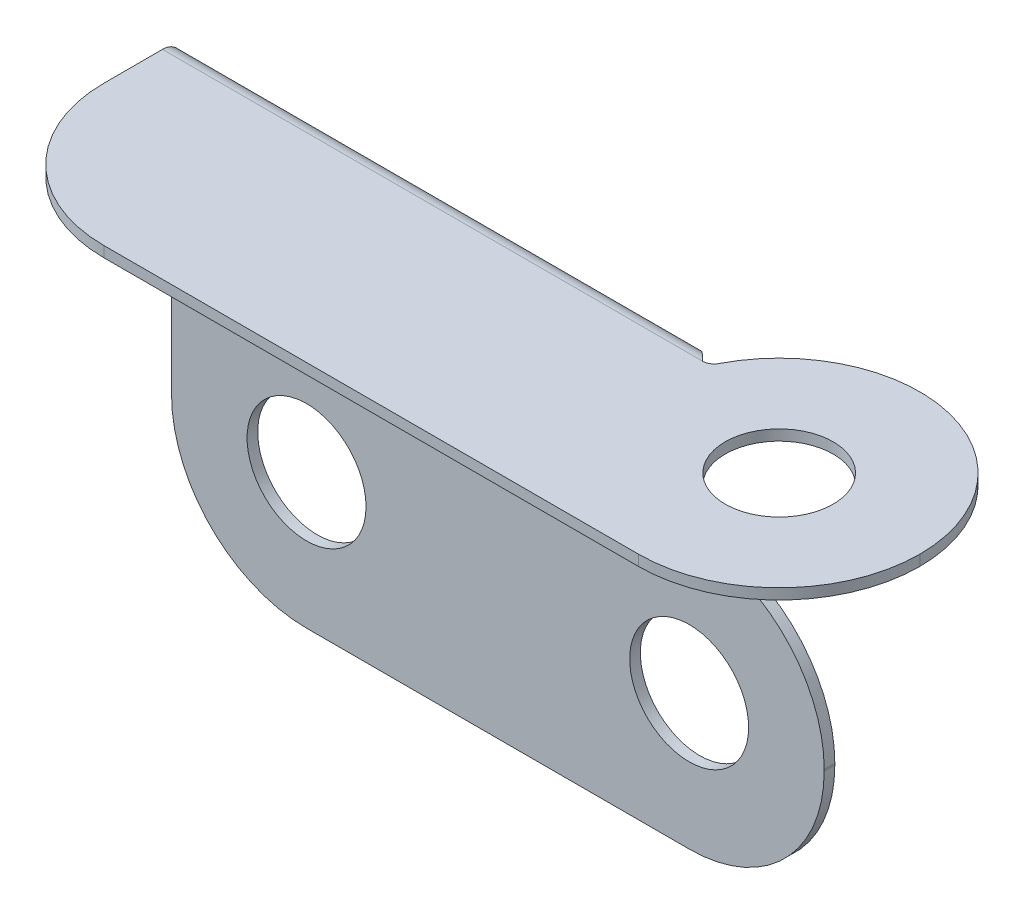
ISO-10303-21;
HEADER;
FILE_DESCRIPTION(('STEP AP214'),'2;1');
FILE_NAME('part.step','',(''),(''),'','','');
FILE_SCHEMA(('AUTOMOTIVE_DESIGN { 1 0 10303 214 1 1 1 1 }'));
ENDSEC;
DATA;
#1=APPLICATION_CONTEXT('core data for automotive mechanical design processes');
#2=APPLICATION_PROTOCOL_DEFINITION('international standard','automotive_design',2000,#1);
#3=PRODUCT_CONTEXT('',#1,'mechanical');
#4=PRODUCT('Part','Part','',(#3));
#5=PRODUCT_RELATED_PRODUCT_CATEGORY('part','',(#4));
#6=PRODUCT_DEFINITION_FORMATION('','',#4);
#7=PRODUCT_DEFINITION_CONTEXT('part definition',#1,'design');
#8=PRODUCT_DEFINITION('design','',#6,#7);
#9=PRODUCT_DEFINITION_SHAPE('','',#8);
#10=(LENGTH_UNIT() NAMED_UNIT(*) SI_UNIT(.MILLI.,.METRE.));
#11=(NAMED_UNIT(*) PLANE_ANGLE_UNIT() SI_UNIT($,.RADIAN.));
#12=(NAMED_UNIT(*) SI_UNIT($,.STERADIAN.) SOLID_ANGLE_UNIT());
#13=UNCERTAINTY_MEASURE_WITH_UNIT(LENGTH_MEASURE(1.E-05),#10,'distance_accuracy_value','');
#14=(GEOMETRIC_REPRESENTATION_CONTEXT(3) GLOBAL_UNCERTAINTY_ASSIGNED_CONTEXT((#13)) GLOBAL_UNIT_ASSIGNED_CONTEXT((#10,
#11,#12)) REPRESENTATION_CONTEXT('',''));
#15=CARTESIAN_POINT('',(0.,0.,0.));
#16=DIRECTION('',(0.,0.,1.));
#17=DIRECTION('',(1.,0.,0.));
#18=AXIS2_PLACEMENT_3D('',#15,#16,#17);
#19=CARTESIAN_POINT('',(19.685,16.51,5.334));
#20=DIRECTION('',(0.,1.,0.));
#21=DIRECTION('',(-1.,0.,0.));
#22=AXIS2_PLACEMENT_3D('',#19,#20,#21);
#23=CYLINDRICAL_SURFACE('',#22,7.9375);
#24=CARTESIAN_POINT('',(19.685,16.51,5.334));
#25=DIRECTION('',(0.,1.,0.));
#26=DIRECTION('',(-1.,0.,0.));
#27=AXIS2_PLACEMENT_3D('',#24,#25,#26);
#28=CIRCLE('',#27,7.9375);
#29=CARTESIAN_POINT('',(12.6362392924122,16.51,1.68449609711593));
#30=VERTEX_POINT('',#29);
#31=CARTESIAN_POINT('',(27.6225,16.51,5.334));
#32=VERTEX_POINT('',#31);
#33=EDGE_CURVE('E479',#30,#32,#28,.F.);
#34=ORIENTED_EDGE('',*,*,#33,.F.);
#35=DIRECTION('',(0.,-1.,0.));
#36=VECTOR('',#35,1.);
#37=CARTESIAN_POINT('',(12.6362392924122,19.05,1.68449609711593));
#38=LINE('',#37,#36);
#39=CARTESIAN_POINT('',(12.6362392924122,17.11,1.68449609711593));
#40=VERTEX_POINT('',#39);
#41=EDGE_CURVE('E138',#40,#30,#38,.T.);
#42=ORIENTED_EDGE('',*,*,#41,.F.);
#43=CARTESIAN_POINT('',(19.685,17.11,5.334));
#44=DIRECTION('',(0.,1.,0.));
#45=DIRECTION('',(-1.,0.,0.));
#46=AXIS2_PLACEMENT_3D('',#43,#44,#45);
#47=CIRCLE('',#46,7.9375);
#48=CARTESIAN_POINT('',(27.6225,17.11,5.334));
#49=VERTEX_POINT('',#48);
#50=EDGE_CURVE('E136',#40,#49,#47,.F.);
#51=ORIENTED_EDGE('',*,*,#50,.T.);
#52=DIRECTION('',(0.,-1.,0.));
#53=VECTOR('',#52,1.);
#54=CARTESIAN_POINT('',(27.6225,16.51,5.334));
#55=LINE('',#54,#53);
#56=EDGE_CURVE('E50',#49,#32,#55,.T.);
#57=ORIENTED_EDGE('',*,*,#56,.T.);
#58=EDGE_LOOP('',(#34,#42,#51,#57));
#59=FACE_BOUND('',#58,.T.);
#60=ADVANCED_FACE('F38',(#59),#23,.T.);
#61=CARTESIAN_POINT('',(19.685,16.51,5.334));
#62=DIRECTION('',(0.,1.,0.));
#63=DIRECTION('',(-1.,0.,0.));
#64=AXIS2_PLACEMENT_3D('',#61,#62,#63);
#65=CYLINDRICAL_SURFACE('',#64,7.9375);
#66=ORIENTED_EDGE('',*,*,#56,.F.);
#67=CARTESIAN_POINT('',(19.685,17.11,5.334));
#68=DIRECTION('',(0.,1.,0.));
#69=DIRECTION('',(-1.,0.,0.));
#70=AXIS2_PLACEMENT_3D('',#67,#68,#69);
#71=CIRCLE('',#70,7.9375);
#72=CARTESIAN_POINT('',(19.685,17.11,13.2715));
#73=VERTEX_POINT('',#72);
#74=EDGE_CURVE('E269',#49,#73,#71,.F.);
#75=ORIENTED_EDGE('',*,*,#74,.T.);
#76=DIRECTION('',(0.,-1.,0.));
#77=VECTOR('',#76,1.);
#78=CARTESIAN_POINT('',(19.685,16.51,13.2715));
#79=LINE('',#78,#77);
#80=CARTESIAN_POINT('',(19.685,16.51,13.2715));
#81=VERTEX_POINT('',#80);
#82=EDGE_CURVE('E275',#73,#81,#79,.T.);
#83=ORIENTED_EDGE('',*,*,#82,.T.);
#84=CARTESIAN_POINT('',(19.685,16.51,5.334));
#85=DIRECTION('',(0.,1.,0.));
#86=DIRECTION('',(-1.,0.,0.));
#87=AXIS2_PLACEMENT_3D('',#84,#85,#86);
#88=CIRCLE('',#87,7.9375);
#89=EDGE_CURVE('E272',#32,#81,#88,.F.);
#90=ORIENTED_EDGE('',*,*,#89,.F.);
#91=EDGE_LOOP('',(#66,#75,#83,#90));
#92=FACE_BOUND('',#91,.T.);
#93=ADVANCED_FACE('F257',(#92),#65,.T.);
#94=CARTESIAN_POINT('',(27.6225,16.51,13.2715));
#95=DIRECTION('',(0.,0.,1.));
#96=DIRECTION('',(1.,0.,0.));
#97=AXIS2_PLACEMENT_3D('',#94,#95,#96);
#98=PLANE('',#97);
#99=ORIENTED_EDGE('',*,*,#82,.F.);
#100=DIRECTION('',(-1.,0.,0.));
#101=VECTOR('',#100,1.);
#102=CARTESIAN_POINT('',(27.6225,17.11,13.2715));
#103=LINE('',#102,#101);
#104=CARTESIAN_POINT('',(-10.4775,17.11,13.2715));
#105=VERTEX_POINT('',#104);
#106=EDGE_CURVE('E279',#105,#73,#103,.F.);
#107=ORIENTED_EDGE('',*,*,#106,.F.);
#108=DIRECTION('',(0.,-1.,0.));
#109=VECTOR('',#108,1.);
#110=CARTESIAN_POINT('',(-10.4775,16.51,13.2715));
#111=LINE('',#110,#109);
#112=CARTESIAN_POINT('',(-10.4775,16.51,13.2715));
#113=VERTEX_POINT('',#112);
#114=EDGE_CURVE('E368',#105,#113,#111,.T.);
#115=ORIENTED_EDGE('',*,*,#114,.T.);
#116=DIRECTION('',(1.,0.,0.));
#117=VECTOR('',#116,1.);
#118=CARTESIAN_POINT('',(27.6225,16.51,13.2715));
#119=LINE('',#118,#117);
#120=EDGE_CURVE('E373',#113,#81,#119,.T.);
#121=ORIENTED_EDGE('',*,*,#120,.T.);
#122=EDGE_LOOP('',(#99,#107,#115,#121));
#123=FACE_BOUND('',#122,.T.);
#124=ADVANCED_FACE('F254',(#123),#98,.T.);
#125=CARTESIAN_POINT('',(-10.4775,16.51,5.334));
#126=DIRECTION('',(0.,1.,0.));
#127=DIRECTION('',(-1.,0.,0.));
#128=AXIS2_PLACEMENT_3D('',#125,#126,#127);
#129=CYLINDRICAL_SURFACE('',#128,7.9375);
#130=ORIENTED_EDGE('',*,*,#114,.F.);
#131=CARTESIAN_POINT('',(-10.4775,17.11,5.334));
#132=DIRECTION('',(0.,1.,0.));
#133=DIRECTION('',(-1.,0.,0.));
#134=AXIS2_PLACEMENT_3D('',#131,#132,#133);
#135=CIRCLE('',#134,7.9375);
#136=CARTESIAN_POINT('',(-18.415,17.11,5.334));
#137=VERTEX_POINT('',#136);
#138=EDGE_CURVE('E331',#105,#137,#135,.F.);
#139=ORIENTED_EDGE('',*,*,#138,.T.);
#140=DIRECTION('',(0.,-1.,0.));
#141=VECTOR('',#140,1.);
#142=CARTESIAN_POINT('',(-18.415,16.51,5.334));
#143=LINE('',#142,#141);
#144=CARTESIAN_POINT('',(-18.415,16.51,5.334));
#145=VERTEX_POINT('',#144);
#146=EDGE_CURVE('E365',#137,#145,#143,.T.);
#147=ORIENTED_EDGE('',*,*,#146,.T.);
#148=CARTESIAN_POINT('',(-10.4775,16.51,5.334));
#149=DIRECTION('',(0.,1.,0.));
#150=DIRECTION('',(-1.,0.,0.));
#151=AXIS2_PLACEMENT_3D('',#148,#149,#150);
#152=CIRCLE('',#151,7.9375);
#153=EDGE_CURVE('E473',#113,#145,#152,.F.);
#154=ORIENTED_EDGE('',*,*,#153,.F.);
#155=EDGE_LOOP('',(#130,#139,#147,#154));
#156=FACE_BOUND('',#155,.T.);
#157=ADVANCED_FACE('F250',(#156),#129,.T.);
#158=CARTESIAN_POINT('',(-18.415,16.51,40.3019963374704));
#159=DIRECTION('',(1.,0.,0.));
#160=DIRECTION('',(0.,0.,-1.));
#161=AXIS2_PLACEMENT_3D('',#158,#159,#160);
#162=PLANE('',#161);
#163=ORIENTED_EDGE('',*,*,#146,.F.);
#164=DIRECTION('',(0.,0.,1.));
#165=VECTOR('',#164,1.);
#166=CARTESIAN_POINT('',(-18.415,17.11,13.2715));
#167=LINE('',#166,#165);
#168=CARTESIAN_POINT('',(-18.415,17.11,2.032));
#169=VERTEX_POINT('',#168);
#170=EDGE_CURVE('E326',#137,#169,#167,.F.);
#171=ORIENTED_EDGE('',*,*,#170,.T.);
#172=DIRECTION('',(0.,-1.,0.));
#173=VECTOR('',#172,1.);
#174=CARTESIAN_POINT('',(-18.415,16.51,2.032));
#175=LINE('',#174,#173);
#176=CARTESIAN_POINT('',(-18.415,16.51,2.032));
#177=VERTEX_POINT('',#176);
#178=EDGE_CURVE('E378',#169,#177,#175,.T.);
#179=ORIENTED_EDGE('',*,*,#178,.T.);
#180=DIRECTION('',(0.,0.,-1.));
#181=VECTOR('',#180,1.);
#182=CARTESIAN_POINT('',(-18.415,16.51,40.3019963374704));
#183=LINE('',#182,#181);
#184=EDGE_CURVE('E469',#145,#177,#183,.T.);
#185=ORIENTED_EDGE('',*,*,#184,.F.);
#186=EDGE_LOOP('',(#163,#171,#179,#185));
#187=FACE_BOUND('',#186,.T.);
#188=ADVANCED_FACE('F246',(#187),#162,.F.);
#189=CARTESIAN_POINT('',(-18.415,16.002,2.032));
#190=DIRECTION('',(-1.,0.,0.));
#191=DIRECTION('',(0.,-1.,0.));
#192=AXIS2_PLACEMENT_3D('',#189,#190,#191);
#193=PLANE('',#192);
#194=ORIENTED_EDGE('',*,*,#178,.F.);
#195=CARTESIAN_POINT('',(-18.415,16.002,2.032));
#196=DIRECTION('',(1.,0.,0.));
#197=DIRECTION('',(0.,1.,0.));
#198=AXIS2_PLACEMENT_3D('',#195,#196,#197);
#199=CIRCLE('',#198,1.108);
#200=CARTESIAN_POINT('',(-18.415,16.002,0.924000000000001));
#201=VERTEX_POINT('',#200);
#202=EDGE_CURVE('E146',#169,#201,#199,.F.);
#203=ORIENTED_EDGE('',*,*,#202,.T.);
#204=DIRECTION('',(0.,0.,1.));
#205=VECTOR('',#204,1.);
#206=CARTESIAN_POINT('',(-18.415,16.002,1.524));
#207=LINE('',#206,#205);
#208=CARTESIAN_POINT('',(-18.415,16.002,1.524));
#209=VERTEX_POINT('',#208);
#210=EDGE_CURVE('E381',#201,#209,#207,.T.);
#211=ORIENTED_EDGE('',*,*,#210,.T.);
#212=CARTESIAN_POINT('',(-18.415,16.002,2.032));
#213=DIRECTION('',(1.,0.,0.));
#214=DIRECTION('',(0.,1.,0.));
#215=AXIS2_PLACEMENT_3D('',#212,#213,#214);
#216=CIRCLE('',#215,0.508);
#217=EDGE_CURVE('E334',#177,#209,#216,.F.);
#218=ORIENTED_EDGE('',*,*,#217,.F.);
#219=EDGE_LOOP('',(#194,#203,#211,#218));
#220=FACE_BOUND('',#219,.T.);
#221=ADVANCED_FACE('F242',(#220),#193,.T.);
#222=CARTESIAN_POINT('',(-18.415,18.034,1.524));
#223=DIRECTION('',(-1.,0.,0.));
#224=DIRECTION('',(0.,-1.,0.));
#225=AXIS2_PLACEMENT_3D('',#222,#223,#224);
#226=PLANE('',#225);
#227=ORIENTED_EDGE('',*,*,#210,.F.);
#228=DIRECTION('',(0.,1.,0.));
#229=VECTOR('',#228,1.);
#230=CARTESIAN_POINT('',(-18.415,0.,0.924));
#231=LINE('',#230,#229);
#232=CARTESIAN_POINT('',(-18.415,0.,0.924));
#233=VERTEX_POINT('',#232);
#234=EDGE_CURVE('E329',#201,#233,#231,.F.);
#235=ORIENTED_EDGE('',*,*,#234,.T.);
#236=DIRECTION('',(0.,0.,1.));
#237=VECTOR('',#236,1.);
#238=CARTESIAN_POINT('',(-18.415,0.,1.524));
#239=LINE('',#238,#237);
#240=CARTESIAN_POINT('',(-18.415,0.,1.524));
#241=VERTEX_POINT('',#240);
#242=EDGE_CURVE('E383',#233,#241,#239,.T.);
#243=ORIENTED_EDGE('',*,*,#242,.T.);
#244=DIRECTION('',(0.,-1.,0.));
#245=VECTOR('',#244,1.);
#246=CARTESIAN_POINT('',(-18.415,18.034,1.524));
#247=LINE('',#246,#245);
#248=EDGE_CURVE('E436',#209,#241,#247,.T.);
#249=ORIENTED_EDGE('',*,*,#248,.F.);
#250=EDGE_LOOP('',(#227,#235,#243,#249));
#251=FACE_BOUND('',#250,.T.);
#252=ADVANCED_FACE('F238',(#251),#226,.T.);
#253=CARTESIAN_POINT('',(-10.795,0.,1.524));
#254=DIRECTION('',(0.,0.,1.));
#255=DIRECTION('',(1.,0.,0.));
#256=AXIS2_PLACEMENT_3D('',#253,#254,#255);
#257=CYLINDRICAL_SURFACE('',#256,7.62);
#258=ORIENTED_EDGE('',*,*,#242,.F.);
#259=CARTESIAN_POINT('',(-10.795,0.,0.924));
#260=DIRECTION('',(0.,0.,1.));
#261=DIRECTION('',(1.,0.,0.));
#262=AXIS2_PLACEMENT_3D('',#259,#260,#261);
#263=CIRCLE('',#262,7.62);
#264=CARTESIAN_POINT('',(-10.795,-7.62,0.924));
#265=VERTEX_POINT('',#264);
#266=EDGE_CURVE('E355',#233,#265,#263,.T.);
#267=ORIENTED_EDGE('',*,*,#266,.T.);
#268=DIRECTION('',(0.,0.,1.));
#269=VECTOR('',#268,1.);
#270=CARTESIAN_POINT('',(-10.795,-7.62,1.524));
#271=LINE('',#270,#269);
#272=CARTESIAN_POINT('',(-10.795,-7.62,1.524));
#273=VERTEX_POINT('',#272);
#274=EDGE_CURVE('E386',#265,#273,#271,.T.);
#275=ORIENTED_EDGE('',*,*,#274,.T.);
#276=CARTESIAN_POINT('',(-10.795,0.,1.524));
#277=DIRECTION('',(0.,0.,1.));
#278=DIRECTION('',(1.,0.,0.));
#279=AXIS2_PLACEMENT_3D('',#276,#277,#278);
#280=CIRCLE('',#279,7.62);
#281=EDGE_CURVE('E440',#241,#273,#280,.T.);
#282=ORIENTED_EDGE('',*,*,#281,.F.);
#283=EDGE_LOOP('',(#258,#267,#275,#282));
#284=FACE_BOUND('',#283,.T.);
#285=ADVANCED_FACE('F234',(#284),#257,.T.);
#286=CARTESIAN_POINT('',(-18.415,-7.62,1.524));
#287=DIRECTION('',(0.,-1.,0.));
#288=DIRECTION('',(1.,0.,0.));
#289=AXIS2_PLACEMENT_3D('',#286,#287,#288);
#290=PLANE('',#289);
#291=ORIENTED_EDGE('',*,*,#274,.F.);
#292=DIRECTION('',(1.,0.,0.));
#293=VECTOR('',#292,1.);
#294=CARTESIAN_POINT('',(0.,-7.62,0.924));
#295=LINE('',#294,#293);
#296=CARTESIAN_POINT('',(10.795,-7.62,0.924));
#297=VERTEX_POINT('',#296);
#298=EDGE_CURVE('E352',#265,#297,#295,.T.);
#299=ORIENTED_EDGE('',*,*,#298,.T.);
#300=DIRECTION('',(0.,0.,1.));
#301=VECTOR('',#300,1.);
#302=CARTESIAN_POINT('',(10.795,-7.62,1.524));
#303=LINE('',#302,#301);
#304=CARTESIAN_POINT('',(10.795,-7.62,1.524));
#305=VERTEX_POINT('',#304);
#306=EDGE_CURVE('E389',#297,#305,#303,.T.);
#307=ORIENTED_EDGE('',*,*,#306,.T.);
#308=DIRECTION('',(1.,0.,0.));
#309=VECTOR('',#308,1.);
#310=CARTESIAN_POINT('',(-18.415,-7.62,1.524));
#311=LINE('',#310,#309);
#312=EDGE_CURVE('E443',#273,#305,#311,.T.);
#313=ORIENTED_EDGE('',*,*,#312,.F.);
#314=EDGE_LOOP('',(#291,#299,#307,#313));
#315=FACE_BOUND('',#314,.T.);
#316=ADVANCED_FACE('F230',(#315),#290,.T.);
#317=CARTESIAN_POINT('',(10.795,0.,1.524));
#318=DIRECTION('',(0.,0.,1.));
#319=DIRECTION('',(1.,0.,0.));
#320=AXIS2_PLACEMENT_3D('',#317,#318,#319);
#321=CYLINDRICAL_SURFACE('',#320,7.62);
#322=ORIENTED_EDGE('',*,*,#306,.F.);
#323=CARTESIAN_POINT('',(10.795,0.,0.924));
#324=DIRECTION('',(0.,0.,1.));
#325=DIRECTION('',(1.,0.,0.));
#326=AXIS2_PLACEMENT_3D('',#323,#324,#325);
#327=CIRCLE('',#326,7.62);
#328=CARTESIAN_POINT('',(18.415,0.,0.924));
#329=VERTEX_POINT('',#328);
#330=EDGE_CURVE('E349',#297,#329,#327,.T.);
#331=ORIENTED_EDGE('',*,*,#330,.T.);
#332=DIRECTION('',(0.,0.,1.));
#333=VECTOR('',#332,1.);
#334=CARTESIAN_POINT('',(18.415,0.,1.524));
#335=LINE('',#334,#333);
#336=CARTESIAN_POINT('',(18.415,0.,1.524));
#337=VERTEX_POINT('',#336);
#338=EDGE_CURVE('E392',#329,#337,#335,.T.);
#339=ORIENTED_EDGE('',*,*,#338,.T.);
#340=CARTESIAN_POINT('',(10.795,0.,1.524));
#341=DIRECTION('',(0.,0.,1.));
#342=DIRECTION('',(1.,0.,0.));
#343=AXIS2_PLACEMENT_3D('',#340,#341,#342);
#344=CIRCLE('',#343,7.62);
#345=EDGE_CURVE('E451',#305,#337,#344,.T.);
#346=ORIENTED_EDGE('',*,*,#345,.F.);
#347=EDGE_LOOP('',(#322,#331,#339,#346));
#348=FACE_BOUND('',#347,.T.);
#349=ADVANCED_FACE('F226',(#348),#321,.T.);
#350=CARTESIAN_POINT('',(18.415,7.62,1.524));
#351=DIRECTION('',(1.,0.,0.));
#352=DIRECTION('',(0.,1.,0.));
#353=AXIS2_PLACEMENT_3D('',#350,#351,#352);
#354=PLANE('',#353);
#355=ORIENTED_EDGE('',*,*,#338,.F.);
#356=DIRECTION('',(0.,1.,0.));
#357=VECTOR('',#356,1.);
#358=CARTESIAN_POINT('',(18.415,0.,0.924));
#359=LINE('',#358,#357);
#360=CARTESIAN_POINT('',(18.415,0.0796875048439151,0.924));
#361=VERTEX_POINT('',#360);
#362=EDGE_CURVE('E346',#329,#361,#359,.T.);
#363=ORIENTED_EDGE('',*,*,#362,.T.);
#364=DIRECTION('',(0.,0.,1.));
#365=VECTOR('',#364,1.);
#366=CARTESIAN_POINT('',(18.415,0.0796875048439151,1.524));
#367=LINE('',#366,#365);
#368=CARTESIAN_POINT('',(18.415,0.0796875048439151,1.524));
#369=VERTEX_POINT('',#368);
#370=EDGE_CURVE('E395',#361,#369,#367,.T.);
#371=ORIENTED_EDGE('',*,*,#370,.T.);
#372=DIRECTION('',(0.,1.,0.));
#373=VECTOR('',#372,1.);
#374=CARTESIAN_POINT('',(18.415,7.62,1.524));
#375=LINE('',#374,#373);
#376=EDGE_CURVE('E454',#337,#369,#375,.T.);
#377=ORIENTED_EDGE('',*,*,#376,.F.);
#378=EDGE_LOOP('',(#355,#363,#371,#377));
#379=FACE_BOUND('',#378,.T.);
#380=ADVANCED_FACE('F222',(#379),#354,.T.);
#381=CARTESIAN_POINT('',(10.795,0.0796875048439116,1.524));
#382=DIRECTION('',(0.,0.,1.));
#383=DIRECTION('',(1.,0.,0.));
#384=AXIS2_PLACEMENT_3D('',#381,#382,#383);
#385=CYLINDRICAL_SURFACE('',#384,7.62);
#386=ORIENTED_EDGE('',*,*,#370,.F.);
#387=CARTESIAN_POINT('',(10.795,0.0796875048439116,0.923999999999999));
#388=DIRECTION('',(0.,0.,1.));
#389=DIRECTION('',(1.,0.,0.));
#390=AXIS2_PLACEMENT_3D('',#387,#388,#389);
#391=CIRCLE('',#390,7.62);
#392=CARTESIAN_POINT('',(11.7475,7.63992187621098,0.924));
#393=VERTEX_POINT('',#392);
#394=EDGE_CURVE('E343',#361,#393,#391,.T.);
#395=ORIENTED_EDGE('',*,*,#394,.T.);
#396=DIRECTION('',(0.,0.,1.));
#397=VECTOR('',#396,1.);
#398=CARTESIAN_POINT('',(11.7475,7.63992187621098,1.524));
#399=LINE('',#398,#397);
#400=CARTESIAN_POINT('',(11.7475,7.63992187621098,1.524));
#401=VERTEX_POINT('',#400);
#402=EDGE_CURVE('E398',#393,#401,#399,.T.);
#403=ORIENTED_EDGE('',*,*,#402,.T.);
#404=CARTESIAN_POINT('',(10.795,0.0796875048439116,1.524));
#405=DIRECTION('',(0.,0.,1.));
#406=DIRECTION('',(1.,0.,0.));
#407=AXIS2_PLACEMENT_3D('',#404,#405,#406);
#408=CIRCLE('',#407,7.62);
#409=EDGE_CURVE('E457',#369,#401,#408,.T.);
#410=ORIENTED_EDGE('',*,*,#409,.F.);
#411=EDGE_LOOP('',(#386,#395,#403,#410));
#412=FACE_BOUND('',#411,.T.);
#413=ADVANCED_FACE('F218',(#412),#385,.T.);
#414=CARTESIAN_POINT('',(12.065,10.16,1.524));
#415=DIRECTION('',(0.,0.,1.));
#416=DIRECTION('',(1.,0.,0.));
#417=AXIS2_PLACEMENT_3D('',#414,#415,#416);
#418=CYLINDRICAL_SURFACE('',#417,2.54);
#419=ORIENTED_EDGE('',*,*,#402,.F.);
#420=CARTESIAN_POINT('',(12.065,10.16,0.923999999999999));
#421=DIRECTION('',(0.,0.,1.));
#422=DIRECTION('',(1.,0.,0.));
#423=AXIS2_PLACEMENT_3D('',#420,#421,#422);
#424=CIRCLE('',#423,2.54);
#425=CARTESIAN_POINT('',(9.52500000000001,10.16,0.924));
#426=VERTEX_POINT('',#425);
#427=EDGE_CURVE('E340',#426,#393,#424,.T.);
#428=ORIENTED_EDGE('',*,*,#427,.F.);
#429=DIRECTION('',(0.,0.,1.));
#430=VECTOR('',#429,1.);
#431=CARTESIAN_POINT('',(9.52500000000001,10.16,1.524));
#432=LINE('',#431,#430);
#433=CARTESIAN_POINT('',(9.52500000000001,10.16,1.524));
#434=VERTEX_POINT('',#433);
#435=EDGE_CURVE('E400',#426,#434,#432,.T.);
#436=ORIENTED_EDGE('',*,*,#435,.T.);
#437=CARTESIAN_POINT('',(12.065,10.16,1.524));
#438=DIRECTION('',(0.,0.,1.));
#439=DIRECTION('',(1.,0.,0.));
#440=AXIS2_PLACEMENT_3D('',#437,#438,#439);
#441=CIRCLE('',#440,2.54);
#442=EDGE_CURVE('E460',#434,#401,#441,.T.);
#443=ORIENTED_EDGE('',*,*,#442,.T.);
#444=EDGE_LOOP('',(#419,#428,#436,#443));
#445=FACE_BOUND('',#444,.T.);
#446=ADVANCED_FACE('F214',(#445),#418,.F.);
#447=CARTESIAN_POINT('',(9.52500000000001,0.,1.524));
#448=DIRECTION('',(-1.,0.,0.));
#449=DIRECTION('',(0.,-1.,0.));
#450=AXIS2_PLACEMENT_3D('',#447,#448,#449);
#451=PLANE('',#450);
#452=ORIENTED_EDGE('',*,*,#435,.F.);
#453=DIRECTION('',(0.,1.,0.));
#454=VECTOR('',#453,1.);
#455=CARTESIAN_POINT('',(9.52500000000001,0.,0.924));
#456=LINE('',#455,#454);
#457=CARTESIAN_POINT('',(9.52500000000001,13.97,0.924));
#458=VERTEX_POINT('',#457);
#459=EDGE_CURVE('E337',#458,#426,#456,.F.);
#460=ORIENTED_EDGE('',*,*,#459,.F.);
#461=DIRECTION('',(0.,0.,1.));
#462=VECTOR('',#461,1.);
#463=CARTESIAN_POINT('',(9.52500000000001,13.97,1.524));
#464=LINE('',#463,#462);
#465=CARTESIAN_POINT('',(9.52500000000001,13.97,1.524));
#466=VERTEX_POINT('',#465);
#467=EDGE_CURVE('E163',#458,#466,#464,.T.);
#468=ORIENTED_EDGE('',*,*,#467,.T.);
#469=DIRECTION('',(0.,-1.,0.));
#470=VECTOR('',#469,1.);
#471=CARTESIAN_POINT('',(9.52500000000001,0.,1.524));
#472=LINE('',#471,#470);
#473=EDGE_CURVE('E431',#466,#434,#472,.T.);
#474=ORIENTED_EDGE('',*,*,#473,.T.);
#475=EDGE_LOOP('',(#452,#460,#468,#474));
#476=FACE_BOUND('',#475,.T.);
#477=ADVANCED_FACE('F210',(#476),#451,.F.);
#478=CARTESIAN_POINT('',(12.065,13.97,1.524));
#479=DIRECTION('',(0.,0.,1.));
#480=DIRECTION('',(1.,0.,0.));
#481=AXIS2_PLACEMENT_3D('',#478,#479,#480);
#482=CYLINDRICAL_SURFACE('',#481,2.54);
#483=ORIENTED_EDGE('',*,*,#467,.F.);
#484=CARTESIAN_POINT('',(12.065,13.97,0.923999999999999));
#485=DIRECTION('',(0.,0.,1.));
#486=DIRECTION('',(1.,0.,0.));
#487=AXIS2_PLACEMENT_3D('',#484,#485,#486);
#488=CIRCLE('',#487,2.54);
#489=CARTESIAN_POINT('',(10.541,16.002,0.924));
#490=VERTEX_POINT('',#489);
#491=EDGE_CURVE('E149',#490,#458,#488,.T.);
#492=ORIENTED_EDGE('',*,*,#491,.F.);
#493=CARTESIAN_POINT('',(10.541,16.002,1.524));
#494=CARTESIAN_POINT('',(10.541,16.002,0.924000000000001));
#495=B_SPLINE_CURVE_WITH_KNOTS('',1,(#493,#494),.UNSPECIFIED.,.F.,.F.,(2,2),(0.,1.),.UNSPECIFIED.);
#496=CARTESIAN_POINT('',(10.541,16.002,1.524));
#497=VERTEX_POINT('',#496);
#498=EDGE_CURVE('E58',#490,#497,#495,.F.);
#499=ORIENTED_EDGE('',*,*,#498,.T.);
#500=CARTESIAN_POINT('',(12.065,13.97,1.524));
#501=DIRECTION('',(0.,0.,1.));
#502=DIRECTION('',(1.,0.,0.));
#503=AXIS2_PLACEMENT_3D('',#500,#501,#502);
#504=CIRCLE('',#503,2.54);
#505=EDGE_CURVE('E420',#497,#466,#504,.T.);
#506=ORIENTED_EDGE('',*,*,#505,.T.);
#507=EDGE_LOOP('',(#483,#492,#499,#506));
#508=FACE_BOUND('',#507,.T.);
#509=ADVANCED_FACE('F200',(#508),#482,.F.);
#510=CARTESIAN_POINT('',(19.685,16.51,5.334));
#511=DIRECTION('',(0.,1.,0.));
#512=DIRECTION('',(-1.,0.,0.));
#513=AXIS2_PLACEMENT_3D('',#510,#511,#512);
#514=CYLINDRICAL_SURFACE('',#513,3.048);
#515=CARTESIAN_POINT('',(19.685,16.51,5.334));
#516=DIRECTION('',(0.,-1.,0.));
#517=DIRECTION('',(1.,0.,0.));
#518=AXIS2_PLACEMENT_3D('',#515,#516,#517);
#519=CIRCLE('',#518,3.048);
#520=CARTESIAN_POINT('',(16.637,16.51,5.334));
#521=VERTEX_POINT('',#520);
#522=EDGE_CURVE('E435',#521,#521,#519,.T.);
#523=CARTESIAN_POINT('',(19.685,17.11,5.334));
#524=DIRECTION('',(0.,-1.,0.));
#525=DIRECTION('',(1.,0.,0.));
#526=AXIS2_PLACEMENT_3D('',#523,#524,#525);
#527=CIRCLE('',#526,3.048);
#528=CARTESIAN_POINT('',(16.637,17.11,5.334));
#529=VERTEX_POINT('',#528);
#530=EDGE_CURVE('E281',#529,#529,#527,.T.);
#531=CARTESIAN_POINT('',(16.637,16.51,5.334));
#532=CARTESIAN_POINT('',(16.637,16.51625,5.334));
#533=CARTESIAN_POINT('',(16.637,16.5225,5.334));
#534=CARTESIAN_POINT('',(16.637,16.535,5.334));
#535=CARTESIAN_POINT('',(16.637,16.54125,5.334));
#536=CARTESIAN_POINT('',(16.637,16.55375,5.334));
#537=CARTESIAN_POINT('',(16.637,16.56,5.334));
#538=CARTESIAN_POINT('',(16.637,16.5725,5.334));
#539=CARTESIAN_POINT('',(16.637,16.57875,5.334));
#540=CARTESIAN_POINT('',(16.637,16.59125,5.334));
#541=CARTESIAN_POINT('',(16.637,16.5975,5.334));
#542=CARTESIAN_POINT('',(16.637,16.61,5.334));
#543=CARTESIAN_POINT('',(16.637,16.61625,5.334));
#544=CARTESIAN_POINT('',(16.637,16.62875,5.334));
#545=CARTESIAN_POINT('',(16.637,16.635,5.334));
#546=CARTESIAN_POINT('',(16.637,16.6475,5.334));
#547=CARTESIAN_POINT('',(16.637,16.65375,5.334));
#548=CARTESIAN_POINT('',(16.637,16.66625,5.334));
#549=CARTESIAN_POINT('',(16.637,16.6725,5.334));
#550=CARTESIAN_POINT('',(16.637,16.685,5.334));
#551=CARTESIAN_POINT('',(16.637,16.69125,5.334));
#552=CARTESIAN_POINT('',(16.637,16.70375,5.334));
#553=CARTESIAN_POINT('',(16.637,16.71,5.334));
#554=CARTESIAN_POINT('',(16.637,16.7225,5.334));
#555=CARTESIAN_POINT('',(16.637,16.72875,5.334));
#556=CARTESIAN_POINT('',(16.637,16.74125,5.334));
#557=CARTESIAN_POINT('',(16.637,16.7475,5.334));
#558=CARTESIAN_POINT('',(16.637,16.76,5.334));
#559=CARTESIAN_POINT('',(16.637,16.76625,5.334));
#560=CARTESIAN_POINT('',(16.637,16.77875,5.334));
#561=CARTESIAN_POINT('',(16.637,16.785,5.334));
#562=CARTESIAN_POINT('',(16.637,16.7975,5.334));
#563=CARTESIAN_POINT('',(16.637,16.80375,5.334));
#564=CARTESIAN_POINT('',(16.637,16.81625,5.334));
#565=CARTESIAN_POINT('',(16.637,16.8225,5.334));
#566=CARTESIAN_POINT('',(16.637,16.835,5.334));
#567=CARTESIAN_POINT('',(16.637,16.84125,5.334));
#568=CARTESIAN_POINT('',(16.637,16.85375,5.334));
#569=CARTESIAN_POINT('',(16.637,16.86,5.334));
#570=CARTESIAN_POINT('',(16.637,16.8725,5.334));
#571=CARTESIAN_POINT('',(16.637,16.87875,5.334));
#572=CARTESIAN_POINT('',(16.637,16.89125,5.334));
#573=CARTESIAN_POINT('',(16.637,16.8975,5.334));
#574=CARTESIAN_POINT('',(16.637,16.91,5.334));
#575=CARTESIAN_POINT('',(16.637,16.91625,5.334));
#576=CARTESIAN_POINT('',(16.637,16.92875,5.334));
#577=CARTESIAN_POINT('',(16.637,16.935,5.334));
#578=CARTESIAN_POINT('',(16.637,16.9475,5.334));
#579=CARTESIAN_POINT('',(16.637,16.95375,5.334));
#580=CARTESIAN_POINT('',(16.637,16.96625,5.334));
#581=CARTESIAN_POINT('',(16.637,16.9725,5.334));
#582=CARTESIAN_POINT('',(16.637,16.985,5.334));
#583=CARTESIAN_POINT('',(16.637,16.99125,5.334));
#584=CARTESIAN_POINT('',(16.637,17.00375,5.334));
#585=CARTESIAN_POINT('',(16.637,17.01,5.334));
#586=CARTESIAN_POINT('',(16.637,17.0225,5.334));
#587=CARTESIAN_POINT('',(16.637,17.02875,5.334));
#588=CARTESIAN_POINT('',(16.637,17.04125,5.334));
#589=CARTESIAN_POINT('',(16.637,17.0475,5.334));
#590=CARTESIAN_POINT('',(16.637,17.06,5.334));
#591=CARTESIAN_POINT('',(16.637,17.06625,5.334));
#592=CARTESIAN_POINT('',(16.637,17.07875,5.334));
#593=CARTESIAN_POINT('',(16.637,17.085,5.334));
#594=CARTESIAN_POINT('',(16.637,17.0975,5.334));
#595=CARTESIAN_POINT('',(16.637,17.10375,5.334));
#596=CARTESIAN_POINT('',(16.637,17.11,5.334));
#597=B_SPLINE_CURVE_WITH_KNOTS('',3,(#531,#532,#533,#534,#535,#536,#537,#538,#539,#540,#541,
#542,#543,#544,#545,#546,#547,#548,#549,#550,#551,#552,#553,#554,#555,#556,#557,#558,#559,#560,
#561,#562,#563,#564,#565,#566,#567,#568,#569,#570,#571,#572,#573,#574,#575,#576,#577,#578,#579,
#580,#581,#582,#583,#584,#585,#586,#587,#588,#589,#590,#591,#592,#593,#594,#595,#596),
.UNSPECIFIED.,.F.,.F.,(4,2,2,2,2,2,2,2,2,2,2,2,2,2,2,2,2,2,2,2,2,2,2,2,2,2,2,2,2,2,2,2,4),(0.,
0.0187500000000014,0.0375000000000028,0.0562500000000007,0.0750000000000021,0.0937500000000001,
0.112500000000001,0.131250000000003,0.150000000000001,0.168750000000002,0.1875,
0.206250000000002,0.225000000000003,0.243750000000001,0.262500000000002,0.28125,
0.300000000000002,0.318750000000003,0.337500000000001,0.356250000000002,0.375,0.393750000000002,
0.412500000000003,0.431250000000001,0.450000000000003,0.46875,0.487500000000002,
0.506250000000003,0.525000000000001,0.543750000000003,0.5625,0.581250000000002,
0.600000000000003),.UNSPECIFIED.);
#598=EDGE_CURVE('BSEAM40',#521,#529,#597,.T.);
#599=ORIENTED_EDGE('',*,*,#522,.T.);
#600=ORIENTED_EDGE('',*,*,#530,.F.);
#601=ORIENTED_EDGE('',*,*,#598,.T.);
#602=ORIENTED_EDGE('',*,*,#598,.F.);
#603=EDGE_LOOP('',(#599,#601,#600,#602));
#604=FACE_BOUND('',#603,.T.);
#605=ADVANCED_FACE('F40',(#604),#514,.F.);
#606=CARTESIAN_POINT('',(10.795,0.,1.524));
#607=DIRECTION('',(0.,0.,1.));
#608=DIRECTION('',(1.,0.,0.));
#609=AXIS2_PLACEMENT_3D('',#606,#607,#608);
#610=CYLINDRICAL_SURFACE('',#609,3.35614819821684);
#611=CARTESIAN_POINT('',(10.795,0.,1.524));
#612=DIRECTION('',(0.,0.,1.));
#613=DIRECTION('',(1.,0.,0.));
#614=AXIS2_PLACEMENT_3D('',#611,#612,#613);
#615=CIRCLE('',#614,3.35614819821684);
#616=CARTESIAN_POINT('',(14.1511481982168,0.,1.524));
#617=VERTEX_POINT('',#616);
#618=EDGE_CURVE('E321',#617,#617,#615,.T.);
#619=ORIENTED_EDGE('',*,*,#618,.T.);
#620=EDGE_LOOP('',(#619));
#621=FACE_BOUND('',#620,.T.);
#622=CARTESIAN_POINT('',(10.795,0.,0.924));
#623=DIRECTION('',(0.,0.,1.));
#624=DIRECTION('',(1.,0.,0.));
#625=AXIS2_PLACEMENT_3D('',#622,#623,#624);
#626=CIRCLE('',#625,3.35614819821684);
#627=CARTESIAN_POINT('',(14.1511481982168,0.,0.924));
#628=VERTEX_POINT('',#627);
#629=EDGE_CURVE('E324',#628,#628,#626,.T.);
#630=ORIENTED_EDGE('',*,*,#629,.F.);
#631=EDGE_LOOP('',(#630));
#632=FACE_BOUND('',#631,.T.);
#633=ADVANCED_FACE('F309',(#621,#632),#610,.F.);
#634=CARTESIAN_POINT('',(-10.795,0.,1.524));
#635=DIRECTION('',(0.,0.,1.));
#636=DIRECTION('',(1.,0.,0.));
#637=AXIS2_PLACEMENT_3D('',#634,#635,#636);
#638=CYLINDRICAL_SURFACE('',#637,3.35614819821683);
#639=CARTESIAN_POINT('',(-10.795,0.,1.524));
#640=DIRECTION('',(0.,0.,1.));
#641=DIRECTION('',(1.,0.,0.));
#642=AXIS2_PLACEMENT_3D('',#639,#640,#641);
#643=CIRCLE('',#642,3.35614819821683);
#644=CARTESIAN_POINT('',(-7.43885180178316,0.,1.524));
#645=VERTEX_POINT('',#644);
#646=EDGE_CURVE('E441',#645,#645,#643,.T.);
#647=ORIENTED_EDGE('',*,*,#646,.T.);
#648=EDGE_LOOP('',(#647));
#649=FACE_BOUND('',#648,.T.);
#650=CARTESIAN_POINT('',(-10.795,0.,0.924));
#651=DIRECTION('',(0.,0.,1.));
#652=DIRECTION('',(1.,0.,0.));
#653=AXIS2_PLACEMENT_3D('',#650,#651,#652);
#654=CIRCLE('',#653,3.35614819821683);
#655=CARTESIAN_POINT('',(-7.43885180178316,0.,0.924));
#656=VERTEX_POINT('',#655);
#657=EDGE_CURVE('E325',#656,#656,#654,.T.);
#658=ORIENTED_EDGE('',*,*,#657,.F.);
#659=EDGE_LOOP('',(#658));
#660=FACE_BOUND('',#659,.T.);
#661=ADVANCED_FACE('F176',(#649,#660),#638,.F.);
#662=CARTESIAN_POINT('',(10.541,16.002,0.924000000000001));
#663=CARTESIAN_POINT('',(10.6571358252895,16.1919780921566,0.924000000000002));
#664=CARTESIAN_POINT('',(10.7775849123119,16.3554982985096,0.970250306965312));
#665=CARTESIAN_POINT('',(10.9652338634489,16.5661353445247,1.07514699274884));
#666=CARTESIAN_POINT('',(11.0286510665701,16.6301024184068,1.11632081877999));
#667=CARTESIAN_POINT('',(11.1553314506615,16.744687811614,1.20653296528074));
#668=CARTESIAN_POINT('',(11.2189097392892,16.7956618890325,1.25576828561296));
#669=CARTESIAN_POINT('',(11.538548734462,17.021310660447,1.51721492458925));
#670=CARTESIAN_POINT('',(11.8024778286836,17.11,1.77593260748835));
#671=CARTESIAN_POINT('',(12.065,17.11,2.032));
#672=CARTESIAN_POINT('',(10.541,16.002,1.524));
#673=CARTESIAN_POINT('',(10.6571719336092,16.0891289502069,1.524));
#674=CARTESIAN_POINT('',(10.7775849123119,16.1640732271145,1.54520501438465));
#675=CARTESIAN_POINT('',(10.9652338634489,16.2606468908111,1.59329844071863));
#676=CARTESIAN_POINT('',(11.0286510665701,16.2899747550096,1.61217597106519));
#677=CARTESIAN_POINT('',(11.1553314506615,16.3425102962995,1.6535367746955));
#678=CARTESIAN_POINT('',(11.2189097392892,16.3658810826972,1.67611036921605));
#679=CARTESIAN_POINT('',(11.538548734462,16.4693373786165,1.79597940585861));
#680=CARTESIAN_POINT('',(11.8022809529197,16.51,1.91450921551316));
#681=CARTESIAN_POINT('',(12.065,16.51,2.032));
#682=B_SPLINE_SURFACE_WITH_KNOTS('',1,3,((#662,#663,#664,#665,#666,#667,#668,#669,#670,#671),
(#672,#673,#674,#675,#676,#677,#678,#679,#680,#681)),.UNSPECIFIED.,.F.,.F.,.F.,(2,2),(4,2,2,2,
4),(0.,1.),(0.,0.000429999692512446,0.000644999538768669,0.000859999385024892,
0.00171999877004978),.UNSPECIFIED.);
#683=CARTESIAN_POINT('',(10.541,16.002,0.924000000000001));
#684=CARTESIAN_POINT('',(10.6571358252895,16.1919780921566,0.924000000000002));
#685=CARTESIAN_POINT('',(10.7775849123119,16.3554982985096,0.970250306965312));
#686=CARTESIAN_POINT('',(10.9652338634489,16.5661353445247,1.07514699274884));
#687=CARTESIAN_POINT('',(11.0286510665701,16.6301024184068,1.11632081877999));
#688=CARTESIAN_POINT('',(11.1553314506615,16.744687811614,1.20653296528074));
#689=CARTESIAN_POINT('',(11.2189097392892,16.7956618890325,1.25576828561296));
#690=CARTESIAN_POINT('',(11.538548734462,17.021310660447,1.51721492458925));
#691=CARTESIAN_POINT('',(11.8024778286836,17.11,1.77593260748835));
#692=CARTESIAN_POINT('',(12.065,17.11,2.032));
#693=B_SPLINE_CURVE_WITH_KNOTS('',3,(#683,#684,#685,#686,#687,#688,#689,#690,#691,#692),
.UNSPECIFIED.,.F.,.F.,(4,2,2,2,4),(0.,0.000429999692512446,0.000644999538768669,
0.000859999385024892,0.00171999877004978),.UNSPECIFIED.);
#694=CARTESIAN_POINT('',(12.065,17.11,2.032));
#695=VERTEX_POINT('',#694);
#696=EDGE_CURVE('E137',#490,#695,#693,.T.);
#697=CARTESIAN_POINT('',(12.065,17.11,2.032));
#698=CARTESIAN_POINT('',(12.065,16.51,2.032));
#699=B_SPLINE_CURVE_WITH_KNOTS('',1,(#697,#698),.UNSPECIFIED.,.F.,.F.,(2,2),(0.,1.),.UNSPECIFIED.);
#700=CARTESIAN_POINT('',(12.065,16.51,2.032));
#701=VERTEX_POINT('',#700);
#702=EDGE_CURVE('E11',#695,#701,#699,.T.);
#703=CARTESIAN_POINT('',(12.065,16.51,2.032));
#704=CARTESIAN_POINT('',(11.8022809529197,16.51,1.91450921551316));
#705=CARTESIAN_POINT('',(11.538548734462,16.4693373786165,1.79597940585861));
#706=CARTESIAN_POINT('',(11.2189097392892,16.3658810826972,1.67611036921605));
#707=CARTESIAN_POINT('',(11.1553314506615,16.3425102962995,1.6535367746955));
#708=CARTESIAN_POINT('',(11.0286510665701,16.2899747550096,1.61217597106519));
#709=CARTESIAN_POINT('',(10.9652338634489,16.2606468908111,1.59329844071863));
#710=CARTESIAN_POINT('',(10.7775849123119,16.1640732271145,1.54520501438465));
#711=CARTESIAN_POINT('',(10.6571719336092,16.0891289502069,1.524));
#712=CARTESIAN_POINT('',(10.541,16.002,1.524));
#713=B_SPLINE_CURVE_WITH_KNOTS('',3,(#703,#704,#705,#706,#707,#708,#709,#710,#711,#712),
.UNSPECIFIED.,.F.,.F.,(4,2,2,2,4),(0.,0.000859999385024892,0.00107499923128111,
0.00128999907753734,0.00171999877004978),.UNSPECIFIED.);
#714=EDGE_CURVE('E427',#497,#701,#713,.F.);
#715=ORIENTED_EDGE('',*,*,#696,.T.);
#716=ORIENTED_EDGE('',*,*,#702,.T.);
#717=ORIENTED_EDGE('',*,*,#714,.F.);
#718=ORIENTED_EDGE('',*,*,#498,.F.);
#719=EDGE_LOOP('',(#715,#716,#717,#718));
#720=FACE_BOUND('',#719,.T.);
#721=ADVANCED_FACE('F152',(#720),#682,.F.);
#722=CARTESIAN_POINT('',(0.,0.,1.524));
#723=DIRECTION('',(0.,0.,1.));
#724=DIRECTION('',(1.,0.,0.));
#725=AXIS2_PLACEMENT_3D('',#722,#723,#724);
#726=PLANE('',#725);
#727=ORIENTED_EDGE('',*,*,#618,.F.);
#728=EDGE_LOOP('',(#727));
#729=FACE_BOUND('',#728,.T.);
#730=ORIENTED_EDGE('',*,*,#646,.F.);
#731=EDGE_LOOP('',(#730));
#732=FACE_BOUND('',#731,.T.);
#733=ORIENTED_EDGE('',*,*,#505,.F.);
#734=DIRECTION('',(1.,0.,0.));
#735=VECTOR('',#734,1.);
#736=CARTESIAN_POINT('',(0.,16.002,1.524));
#737=LINE('',#736,#735);
#738=EDGE_CURVE('E411',#497,#209,#737,.F.);
#739=ORIENTED_EDGE('',*,*,#738,.T.);
#740=ORIENTED_EDGE('',*,*,#248,.T.);
#741=ORIENTED_EDGE('',*,*,#281,.T.);
#742=ORIENTED_EDGE('',*,*,#312,.T.);
#743=ORIENTED_EDGE('',*,*,#345,.T.);
#744=ORIENTED_EDGE('',*,*,#376,.T.);
#745=ORIENTED_EDGE('',*,*,#409,.T.);
#746=ORIENTED_EDGE('',*,*,#442,.F.);
#747=ORIENTED_EDGE('',*,*,#473,.F.);
#748=EDGE_LOOP('',(#733,#739,#740,#741,#742,#743,#744,#745,#746,#747));
#749=FACE_BOUND('',#748,.T.);
#750=ADVANCED_FACE('F175',(#729,#732,#749),#726,.T.);
#751=CARTESIAN_POINT('',(27.6225,16.51,13.2715));
#752=DIRECTION('',(0.,1.,0.));
#753=DIRECTION('',(-1.,0.,0.));
#754=AXIS2_PLACEMENT_3D('',#751,#752,#753);
#755=PLANE('',#754);
#756=CARTESIAN_POINT('',(12.065,16.51,1.38873630136987));
#757=DIRECTION('',(0.,-1.,0.));
#758=DIRECTION('',(1.,0.,0.));
#759=AXIS2_PLACEMENT_3D('',#756,#757,#758);
#760=CIRCLE('',#759,0.643263698630127);
#761=EDGE_CURVE('E120',#701,#30,#760,.F.);
#762=ORIENTED_EDGE('',*,*,#761,.T.);
#763=ORIENTED_EDGE('',*,*,#33,.T.);
#764=ORIENTED_EDGE('',*,*,#89,.T.);
#765=ORIENTED_EDGE('',*,*,#120,.F.);
#766=ORIENTED_EDGE('',*,*,#153,.T.);
#767=ORIENTED_EDGE('',*,*,#184,.T.);
#768=DIRECTION('',(1.,0.,0.));
#769=VECTOR('',#768,1.);
#770=CARTESIAN_POINT('',(27.6225,16.51,2.032));
#771=LINE('',#770,#769);
#772=EDGE_CURVE('E413',#177,#701,#771,.T.);
#773=ORIENTED_EDGE('',*,*,#772,.T.);
#774=EDGE_LOOP('',(#762,#763,#764,#765,#766,#767,#773));
#775=FACE_BOUND('',#774,.T.);
#776=ORIENTED_EDGE('',*,*,#522,.F.);
#777=EDGE_LOOP('',(#776));
#778=FACE_BOUND('',#777,.T.);
#779=ADVANCED_FACE('F471',(#775,#778),#755,.F.);
#780=CARTESIAN_POINT('',(27.6225,16.002,2.032));
#781=DIRECTION('',(1.,0.,0.));
#782=DIRECTION('',(0.,1.,0.));
#783=AXIS2_PLACEMENT_3D('',#780,#781,#782);
#784=CYLINDRICAL_SURFACE('',#783,0.508);
#785=ORIENTED_EDGE('',*,*,#217,.T.);
#786=ORIENTED_EDGE('',*,*,#738,.F.);
#787=ORIENTED_EDGE('',*,*,#714,.T.);
#788=ORIENTED_EDGE('',*,*,#772,.F.);
#789=EDGE_LOOP('',(#785,#786,#787,#788));
#790=FACE_BOUND('',#789,.T.);
#791=ADVANCED_FACE('F300',(#790),#784,.F.);
#792=CARTESIAN_POINT('',(0.,0.,0.924));
#793=DIRECTION('',(0.,0.,1.));
#794=DIRECTION('',(1.,0.,0.));
#795=AXIS2_PLACEMENT_3D('',#792,#793,#794);
#796=PLANE('',#795);
#797=ORIENTED_EDGE('',*,*,#629,.T.);
#798=EDGE_LOOP('',(#797));
#799=FACE_BOUND('',#798,.T.);
#800=ORIENTED_EDGE('',*,*,#657,.T.);
#801=EDGE_LOOP('',(#800));
#802=FACE_BOUND('',#801,.T.);
#803=ORIENTED_EDGE('',*,*,#491,.T.);
#804=ORIENTED_EDGE('',*,*,#459,.T.);
#805=ORIENTED_EDGE('',*,*,#427,.T.);
#806=ORIENTED_EDGE('',*,*,#394,.F.);
#807=ORIENTED_EDGE('',*,*,#362,.F.);
#808=ORIENTED_EDGE('',*,*,#330,.F.);
#809=ORIENTED_EDGE('',*,*,#298,.F.);
#810=ORIENTED_EDGE('',*,*,#266,.F.);
#811=ORIENTED_EDGE('',*,*,#234,.F.);
#812=DIRECTION('',(1.,0.,0.));
#813=VECTOR('',#812,1.);
#814=CARTESIAN_POINT('',(0.,16.002,0.924));
#815=LINE('',#814,#813);
#816=EDGE_CURVE('E148',#490,#201,#815,.F.);
#817=ORIENTED_EDGE('',*,*,#816,.F.);
#818=EDGE_LOOP('',(#803,#804,#805,#806,#807,#808,#809,#810,#811,#817));
#819=FACE_BOUND('',#818,.T.);
#820=ADVANCED_FACE('F303',(#799,#802,#819),#796,.F.);
#821=CARTESIAN_POINT('',(27.6225,17.11,13.2715));
#822=DIRECTION('',(0.,1.,0.));
#823=DIRECTION('',(-1.,0.,0.));
#824=AXIS2_PLACEMENT_3D('',#821,#822,#823);
#825=PLANE('',#824);
#826=ORIENTED_EDGE('',*,*,#530,.T.);
#827=EDGE_LOOP('',(#826));
#828=FACE_BOUND('',#827,.T.);
#829=ORIENTED_EDGE('',*,*,#50,.F.);
#830=CARTESIAN_POINT('',(12.065,17.11,1.38873630136987));
#831=DIRECTION('',(0.,1.,0.));
#832=DIRECTION('',(-1.,0.,0.));
#833=AXIS2_PLACEMENT_3D('',#830,#831,#832);
#834=CIRCLE('',#833,0.643263698630127);
#835=EDGE_CURVE('E116',#40,#695,#834,.F.);
#836=ORIENTED_EDGE('',*,*,#835,.T.);
#837=DIRECTION('',(-1.,0.,0.));
#838=VECTOR('',#837,1.);
#839=CARTESIAN_POINT('',(27.6225,17.11,2.032));
#840=LINE('',#839,#838);
#841=EDGE_CURVE('E132',#169,#695,#840,.F.);
#842=ORIENTED_EDGE('',*,*,#841,.F.);
#843=ORIENTED_EDGE('',*,*,#170,.F.);
#844=ORIENTED_EDGE('',*,*,#138,.F.);
#845=ORIENTED_EDGE('',*,*,#106,.T.);
#846=ORIENTED_EDGE('',*,*,#74,.F.);
#847=EDGE_LOOP('',(#829,#836,#842,#843,#844,#845,#846));
#848=FACE_BOUND('',#847,.T.);
#849=ADVANCED_FACE('F130',(#828,#848),#825,.T.);
#850=CARTESIAN_POINT('',(27.6225,16.002,2.032));
#851=DIRECTION('',(1.,0.,0.));
#852=DIRECTION('',(0.,1.,0.));
#853=AXIS2_PLACEMENT_3D('',#850,#851,#852);
#854=CYLINDRICAL_SURFACE('',#853,1.108);
#855=ORIENTED_EDGE('',*,*,#202,.F.);
#856=ORIENTED_EDGE('',*,*,#841,.T.);
#857=ORIENTED_EDGE('',*,*,#696,.F.);
#858=ORIENTED_EDGE('',*,*,#816,.T.);
#859=EDGE_LOOP('',(#855,#856,#857,#858));
#860=FACE_BOUND('',#859,.T.);
#861=ADVANCED_FACE('F142',(#860),#854,.T.);
#862=CARTESIAN_POINT('',(12.065,19.05,1.38873630136987));
#863=DIRECTION('',(0.,-1.,0.));
#864=DIRECTION('',(1.,0.,0.));
#865=AXIS2_PLACEMENT_3D('',#862,#863,#864);
#866=CYLINDRICAL_SURFACE('',#865,0.643263698630127);
#867=ORIENTED_EDGE('',*,*,#41,.T.);
#868=ORIENTED_EDGE('',*,*,#761,.F.);
#869=ORIENTED_EDGE('',*,*,#702,.F.);
#870=ORIENTED_EDGE('',*,*,#835,.F.);
#871=EDGE_LOOP('',(#867,#868,#869,#870));
#872=FACE_BOUND('',#871,.T.);
#873=ADVANCED_FACE('F115',(#872),#866,.F.);
#874=CLOSED_SHELL('',(#60,#93,#124,#157,#188,#221,#252,#285,#316,#349,#380,#413,#446,#477,#509,
#605,#633,#661,#721,#750,#779,#791,#820,#849,#861,#873));
#875=MANIFOLD_SOLID_BREP('B2',#874);
#876=ADVANCED_BREP_SHAPE_REPRESENTATION('',(#18,#875),#14);
#877=SHAPE_DEFINITION_REPRESENTATION(#9,#876);
ENDSEC;
END-ISO-10303-21;
